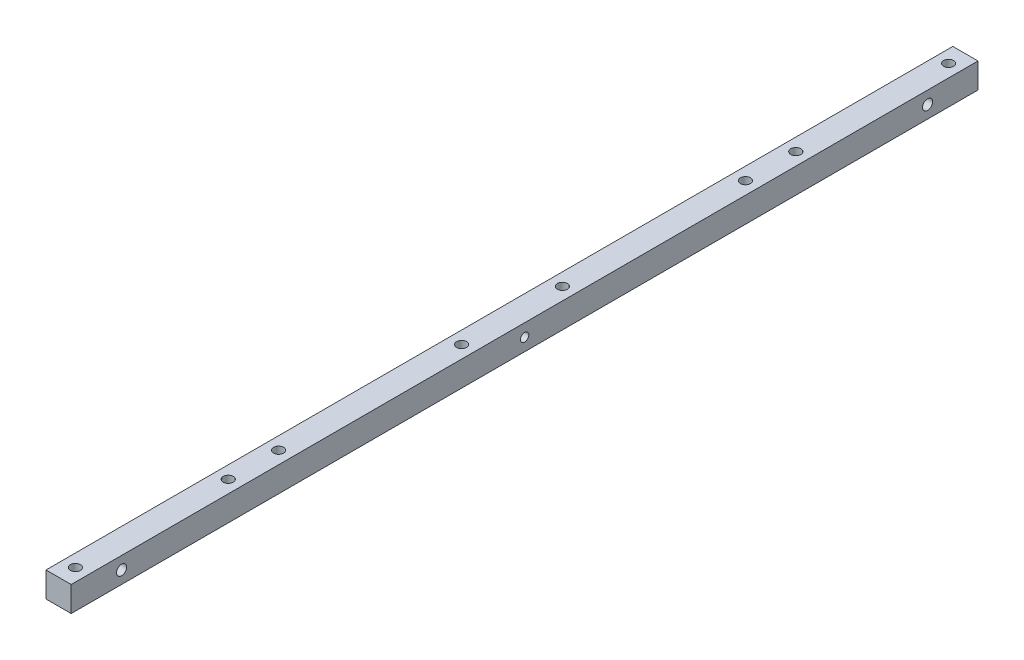
ISO-10303-21;
HEADER;
FILE_DESCRIPTION(('STEP AP214'),'2;1');
FILE_NAME('part.step','',(''),(''),'','','');
FILE_SCHEMA(('AUTOMOTIVE_DESIGN { 1 0 10303 214 1 1 1 1 }'));
ENDSEC;
DATA;
#1=APPLICATION_CONTEXT('core data for automotive mechanical design processes');
#2=APPLICATION_PROTOCOL_DEFINITION('international standard','automotive_design',2000,#1);
#3=PRODUCT_CONTEXT('',#1,'mechanical');
#4=PRODUCT('Part','Part','',(#3));
#5=PRODUCT_RELATED_PRODUCT_CATEGORY('part','',(#4));
#6=PRODUCT_DEFINITION_FORMATION('','',#4);
#7=PRODUCT_DEFINITION_CONTEXT('part definition',#1,'design');
#8=PRODUCT_DEFINITION('design','',#6,#7);
#9=PRODUCT_DEFINITION_SHAPE('','',#8);
#10=(LENGTH_UNIT() NAMED_UNIT(*) SI_UNIT(.MILLI.,.METRE.));
#11=(NAMED_UNIT(*) PLANE_ANGLE_UNIT() SI_UNIT($,.RADIAN.));
#12=(NAMED_UNIT(*) SI_UNIT($,.STERADIAN.) SOLID_ANGLE_UNIT());
#13=UNCERTAINTY_MEASURE_WITH_UNIT(LENGTH_MEASURE(1.E-05),#10,'distance_accuracy_value','');
#14=(GEOMETRIC_REPRESENTATION_CONTEXT(3) GLOBAL_UNCERTAINTY_ASSIGNED_CONTEXT((#13)) GLOBAL_UNIT_ASSIGNED_CONTEXT((#10,
#11,#12)) REPRESENTATION_CONTEXT('',''));
#15=CARTESIAN_POINT('',(0.,0.,0.));
#16=DIRECTION('',(0.,0.,1.));
#17=DIRECTION('',(1.,0.,0.));
#18=AXIS2_PLACEMENT_3D('',#15,#16,#17);
#19=CARTESIAN_POINT('',(3.75,-3.75,135.));
#20=DIRECTION('',(-1.,0.,0.));
#21=DIRECTION('',(0.,0.,1.));
#22=AXIS2_PLACEMENT_3D('',#19,#20,#21);
#23=PLANE('',#22);
#24=CARTESIAN_POINT('',(3.75,0.,120.));
#25=DIRECTION('',(1.,0.,0.));
#26=DIRECTION('',(0.,0.,-1.));
#27=AXIS2_PLACEMENT_3D('',#24,#25,#26);
#28=CIRCLE('',#27,1.5);
#29=CARTESIAN_POINT('',(3.75,0.,118.5));
#30=VERTEX_POINT('',#29);
#31=EDGE_CURVE('E122',#30,#30,#28,.T.);
#32=ORIENTED_EDGE('',*,*,#31,.F.);
#33=EDGE_LOOP('',(#32));
#34=FACE_BOUND('',#33,.T.);
#35=CARTESIAN_POINT('',(3.75,0.,-120.));
#36=DIRECTION('',(1.,0.,0.));
#37=DIRECTION('',(0.,0.,1.));
#38=AXIS2_PLACEMENT_3D('',#35,#36,#37);
#39=CIRCLE('',#38,1.5);
#40=CARTESIAN_POINT('',(3.75,0.,-121.5));
#41=VERTEX_POINT('',#40);
#42=EDGE_CURVE('E116',#41,#41,#39,.T.);
#43=ORIENTED_EDGE('',*,*,#42,.F.);
#44=EDGE_LOOP('',(#43));
#45=FACE_BOUND('',#44,.T.);
#46=CARTESIAN_POINT('',(3.75,0.,0.));
#47=DIRECTION('',(1.,0.,0.));
#48=DIRECTION('',(0.,0.,-1.));
#49=AXIS2_PLACEMENT_3D('',#46,#47,#48);
#50=CIRCLE('',#49,1.25);
#51=CARTESIAN_POINT('',(3.75,0.,-1.25));
#52=VERTEX_POINT('',#51);
#53=EDGE_CURVE('E109',#52,#52,#50,.T.);
#54=ORIENTED_EDGE('',*,*,#53,.F.);
#55=EDGE_LOOP('',(#54));
#56=FACE_BOUND('',#55,.T.);
#57=DIRECTION('',(0.,1.,0.));
#58=VECTOR('',#57,1.);
#59=CARTESIAN_POINT('',(3.75,-3.75,-135.));
#60=LINE('',#59,#58);
#61=CARTESIAN_POINT('',(3.75,-3.75,-135.));
#62=VERTEX_POINT('',#61);
#63=CARTESIAN_POINT('',(3.75,3.75,-135.));
#64=VERTEX_POINT('',#63);
#65=EDGE_CURVE('E95',#62,#64,#60,.T.);
#66=ORIENTED_EDGE('',*,*,#65,.T.);
#67=DIRECTION('',(0.,0.,-1.));
#68=VECTOR('',#67,1.);
#69=CARTESIAN_POINT('',(3.75,3.75,135.));
#70=LINE('',#69,#68);
#71=CARTESIAN_POINT('',(3.75,3.75,135.));
#72=VERTEX_POINT('',#71);
#73=EDGE_CURVE('E11',#72,#64,#70,.T.);
#74=ORIENTED_EDGE('',*,*,#73,.F.);
#75=DIRECTION('',(0.,1.,0.));
#76=VECTOR('',#75,1.);
#77=CARTESIAN_POINT('',(3.75,-3.75,135.));
#78=LINE('',#77,#76);
#79=CARTESIAN_POINT('',(3.75,-3.75,135.));
#80=VERTEX_POINT('',#79);
#81=EDGE_CURVE('E83',#80,#72,#78,.T.);
#82=ORIENTED_EDGE('',*,*,#81,.F.);
#83=DIRECTION('',(0.,0.,-1.));
#84=VECTOR('',#83,1.);
#85=CARTESIAN_POINT('',(3.75,-3.75,135.));
#86=LINE('',#85,#84);
#87=EDGE_CURVE('E91',#80,#62,#86,.T.);
#88=ORIENTED_EDGE('',*,*,#87,.T.);
#89=EDGE_LOOP('',(#66,#74,#82,#88));
#90=FACE_BOUND('',#89,.T.);
#91=ADVANCED_FACE('F32',(#34,#45,#56,#90),#23,.F.);
#92=CARTESIAN_POINT('',(-3.75,3.75,135.));
#93=DIRECTION('',(0.,-1.,0.));
#94=DIRECTION('',(0.,0.,-1.));
#95=AXIS2_PLACEMENT_3D('',#92,#93,#94);
#96=PLANE('',#95);
#97=CARTESIAN_POINT('',(0.,3.75,130.));
#98=DIRECTION('',(0.,1.,0.));
#99=DIRECTION('',(0.,0.,1.));
#100=AXIS2_PLACEMENT_3D('',#97,#98,#99);
#101=CIRCLE('',#100,1.5);
#102=CARTESIAN_POINT('',(0.,3.75,131.5));
#103=VERTEX_POINT('',#102);
#104=EDGE_CURVE('E145',#103,#103,#101,.T.);
#105=ORIENTED_EDGE('',*,*,#104,.F.);
#106=EDGE_LOOP('',(#105));
#107=FACE_BOUND('',#106,.T.);
#108=CARTESIAN_POINT('',(0.,3.75,-69.5));
#109=DIRECTION('',(0.,1.,0.));
#110=DIRECTION('',(0.,0.,-1.));
#111=AXIS2_PLACEMENT_3D('',#108,#109,#110);
#112=CIRCLE('',#111,1.5);
#113=CARTESIAN_POINT('',(0.,3.75,-71.));
#114=VERTEX_POINT('',#113);
#115=EDGE_CURVE('E152',#114,#114,#112,.T.);
#116=ORIENTED_EDGE('',*,*,#115,.F.);
#117=EDGE_LOOP('',(#116));
#118=FACE_BOUND('',#117,.T.);
#119=CARTESIAN_POINT('',(0.,3.75,-84.5));
#120=DIRECTION('',(0.,1.,0.));
#121=DIRECTION('',(0.,0.,-1.));
#122=AXIS2_PLACEMENT_3D('',#119,#120,#121);
#123=CIRCLE('',#122,1.5);
#124=CARTESIAN_POINT('',(0.,3.75,-86.));
#125=VERTEX_POINT('',#124);
#126=EDGE_CURVE('E133',#125,#125,#123,.T.);
#127=ORIENTED_EDGE('',*,*,#126,.F.);
#128=EDGE_LOOP('',(#127));
#129=FACE_BOUND('',#128,.T.);
#130=CARTESIAN_POINT('',(0.,3.75,84.5));
#131=DIRECTION('',(0.,1.,0.));
#132=DIRECTION('',(0.,0.,1.));
#133=AXIS2_PLACEMENT_3D('',#130,#131,#132);
#134=CIRCLE('',#133,1.5);
#135=CARTESIAN_POINT('',(0.,3.75,86.));
#136=VERTEX_POINT('',#135);
#137=EDGE_CURVE('E140',#136,#136,#134,.T.);
#138=ORIENTED_EDGE('',*,*,#137,.F.);
#139=EDGE_LOOP('',(#138));
#140=FACE_BOUND('',#139,.T.);
#141=CARTESIAN_POINT('',(0.,3.75,-15.));
#142=DIRECTION('',(0.,1.,0.));
#143=DIRECTION('',(0.,0.,-1.));
#144=AXIS2_PLACEMENT_3D('',#141,#142,#143);
#145=CIRCLE('',#144,1.5);
#146=CARTESIAN_POINT('',(0.,3.75,-16.5));
#147=VERTEX_POINT('',#146);
#148=EDGE_CURVE('E169',#147,#147,#145,.T.);
#149=ORIENTED_EDGE('',*,*,#148,.F.);
#150=EDGE_LOOP('',(#149));
#151=FACE_BOUND('',#150,.T.);
#152=CARTESIAN_POINT('',(0.,3.75,15.));
#153=DIRECTION('',(0.,1.,0.));
#154=DIRECTION('',(0.,0.,1.));
#155=AXIS2_PLACEMENT_3D('',#152,#153,#154);
#156=CIRCLE('',#155,1.5);
#157=CARTESIAN_POINT('',(0.,3.75,16.5));
#158=VERTEX_POINT('',#157);
#159=EDGE_CURVE('E157',#158,#158,#156,.T.);
#160=ORIENTED_EDGE('',*,*,#159,.F.);
#161=EDGE_LOOP('',(#160));
#162=FACE_BOUND('',#161,.T.);
#163=CARTESIAN_POINT('',(0.,3.75,-130.));
#164=DIRECTION('',(0.,1.,0.));
#165=DIRECTION('',(0.,0.,-1.));
#166=AXIS2_PLACEMENT_3D('',#163,#164,#165);
#167=CIRCLE('',#166,1.5);
#168=CARTESIAN_POINT('',(0.,3.75,-131.5));
#169=VERTEX_POINT('',#168);
#170=EDGE_CURVE('E164',#169,#169,#167,.T.);
#171=ORIENTED_EDGE('',*,*,#170,.F.);
#172=EDGE_LOOP('',(#171));
#173=FACE_BOUND('',#172,.T.);
#174=CARTESIAN_POINT('',(0.,3.75,69.5));
#175=DIRECTION('',(0.,1.,0.));
#176=DIRECTION('',(0.,0.,1.));
#177=AXIS2_PLACEMENT_3D('',#174,#175,#176);
#178=CIRCLE('',#177,1.5);
#179=CARTESIAN_POINT('',(0.,3.75,71.));
#180=VERTEX_POINT('',#179);
#181=EDGE_CURVE('E127',#180,#180,#178,.T.);
#182=ORIENTED_EDGE('',*,*,#181,.F.);
#183=EDGE_LOOP('',(#182));
#184=FACE_BOUND('',#183,.T.);
#185=DIRECTION('',(-1.,0.,0.));
#186=VECTOR('',#185,1.);
#187=CARTESIAN_POINT('',(-3.75,3.75,-135.));
#188=LINE('',#187,#186);
#189=CARTESIAN_POINT('',(-3.75,3.75,-135.));
#190=VERTEX_POINT('',#189);
#191=EDGE_CURVE('E87',#64,#190,#188,.T.);
#192=ORIENTED_EDGE('',*,*,#191,.T.);
#193=DIRECTION('',(0.,0.,-1.));
#194=VECTOR('',#193,1.);
#195=CARTESIAN_POINT('',(-3.75,3.75,135.));
#196=LINE('',#195,#194);
#197=CARTESIAN_POINT('',(-3.75,3.75,135.));
#198=VERTEX_POINT('',#197);
#199=EDGE_CURVE('E40',#198,#190,#196,.T.);
#200=ORIENTED_EDGE('',*,*,#199,.F.);
#201=DIRECTION('',(-1.,0.,0.));
#202=VECTOR('',#201,1.);
#203=CARTESIAN_POINT('',(-3.75,3.75,135.));
#204=LINE('',#203,#202);
#205=EDGE_CURVE('E78',#72,#198,#204,.T.);
#206=ORIENTED_EDGE('',*,*,#205,.F.);
#207=ORIENTED_EDGE('',*,*,#73,.T.);
#208=EDGE_LOOP('',(#192,#200,#206,#207));
#209=FACE_BOUND('',#208,.T.);
#210=ADVANCED_FACE('F86',(#107,#118,#129,#140,#151,#162,#173,#184,#209),#96,.F.);
#211=CARTESIAN_POINT('',(-3.75,-3.75,135.));
#212=DIRECTION('',(1.,0.,0.));
#213=DIRECTION('',(0.,0.,-1.));
#214=AXIS2_PLACEMENT_3D('',#211,#212,#213);
#215=PLANE('',#214);
#216=CARTESIAN_POINT('',(-3.75,0.,120.));
#217=DIRECTION('',(1.,0.,0.));
#218=DIRECTION('',(0.,0.,-1.));
#219=AXIS2_PLACEMENT_3D('',#216,#217,#218);
#220=CIRCLE('',#219,1.5);
#221=CARTESIAN_POINT('',(-3.75,0.,118.5));
#222=VERTEX_POINT('',#221);
#223=EDGE_CURVE('E98',#222,#222,#220,.T.);
#224=ORIENTED_EDGE('',*,*,#223,.T.);
#225=EDGE_LOOP('',(#224));
#226=FACE_BOUND('',#225,.T.);
#227=CARTESIAN_POINT('',(-3.75,0.,-120.));
#228=DIRECTION('',(1.,0.,0.));
#229=DIRECTION('',(0.,0.,1.));
#230=AXIS2_PLACEMENT_3D('',#227,#228,#229);
#231=CIRCLE('',#230,1.5);
#232=CARTESIAN_POINT('',(-3.75,0.,-121.5));
#233=VERTEX_POINT('',#232);
#234=EDGE_CURVE('E119',#233,#233,#231,.T.);
#235=ORIENTED_EDGE('',*,*,#234,.T.);
#236=EDGE_LOOP('',(#235));
#237=FACE_BOUND('',#236,.T.);
#238=CARTESIAN_POINT('',(-3.75,0.,0.));
#239=DIRECTION('',(1.,0.,0.));
#240=DIRECTION('',(0.,0.,-1.));
#241=AXIS2_PLACEMENT_3D('',#238,#239,#240);
#242=CIRCLE('',#241,1.25);
#243=CARTESIAN_POINT('',(-3.75,0.,-1.25));
#244=VERTEX_POINT('',#243);
#245=EDGE_CURVE('E112',#244,#244,#242,.T.);
#246=ORIENTED_EDGE('',*,*,#245,.T.);
#247=EDGE_LOOP('',(#246));
#248=FACE_BOUND('',#247,.T.);
#249=DIRECTION('',(0.,-1.,0.));
#250=VECTOR('',#249,1.);
#251=CARTESIAN_POINT('',(-3.75,-3.75,-135.));
#252=LINE('',#251,#250);
#253=CARTESIAN_POINT('',(-3.75,-3.75,-135.));
#254=VERTEX_POINT('',#253);
#255=EDGE_CURVE('E65',#190,#254,#252,.T.);
#256=ORIENTED_EDGE('',*,*,#255,.T.);
#257=DIRECTION('',(0.,0.,-1.));
#258=VECTOR('',#257,1.);
#259=CARTESIAN_POINT('',(-3.75,-3.75,135.));
#260=LINE('',#259,#258);
#261=CARTESIAN_POINT('',(-3.75,-3.75,135.));
#262=VERTEX_POINT('',#261);
#263=EDGE_CURVE('E88',#262,#254,#260,.T.);
#264=ORIENTED_EDGE('',*,*,#263,.F.);
#265=DIRECTION('',(0.,-1.,0.));
#266=VECTOR('',#265,1.);
#267=CARTESIAN_POINT('',(-3.75,-3.75,135.));
#268=LINE('',#267,#266);
#269=EDGE_CURVE('E81',#198,#262,#268,.T.);
#270=ORIENTED_EDGE('',*,*,#269,.F.);
#271=ORIENTED_EDGE('',*,*,#199,.T.);
#272=EDGE_LOOP('',(#256,#264,#270,#271));
#273=FACE_BOUND('',#272,.T.);
#274=ADVANCED_FACE('F89',(#226,#237,#248,#273),#215,.F.);
#275=CARTESIAN_POINT('',(-3.75,-3.75,135.));
#276=DIRECTION('',(0.,1.,0.));
#277=DIRECTION('',(0.,0.,1.));
#278=AXIS2_PLACEMENT_3D('',#275,#276,#277);
#279=PLANE('',#278);
#280=CARTESIAN_POINT('',(0.,-3.75,130.));
#281=DIRECTION('',(0.,1.,0.));
#282=DIRECTION('',(0.,0.,1.));
#283=AXIS2_PLACEMENT_3D('',#280,#281,#282);
#284=CIRCLE('',#283,1.5);
#285=CARTESIAN_POINT('',(0.,-3.75,131.5));
#286=VERTEX_POINT('',#285);
#287=EDGE_CURVE('E148',#286,#286,#284,.T.);
#288=ORIENTED_EDGE('',*,*,#287,.T.);
#289=EDGE_LOOP('',(#288));
#290=FACE_BOUND('',#289,.T.);
#291=CARTESIAN_POINT('',(0.,-3.75,-69.5));
#292=DIRECTION('',(0.,1.,0.));
#293=DIRECTION('',(0.,0.,-1.));
#294=AXIS2_PLACEMENT_3D('',#291,#292,#293);
#295=CIRCLE('',#294,1.5);
#296=CARTESIAN_POINT('',(0.,-3.75,-71.));
#297=VERTEX_POINT('',#296);
#298=EDGE_CURVE('E137',#297,#297,#295,.T.);
#299=ORIENTED_EDGE('',*,*,#298,.T.);
#300=EDGE_LOOP('',(#299));
#301=FACE_BOUND('',#300,.T.);
#302=CARTESIAN_POINT('',(0.,-3.75,-84.5));
#303=DIRECTION('',(0.,1.,0.));
#304=DIRECTION('',(0.,0.,-1.));
#305=AXIS2_PLACEMENT_3D('',#302,#303,#304);
#306=CIRCLE('',#305,1.5);
#307=CARTESIAN_POINT('',(0.,-3.75,-86.));
#308=VERTEX_POINT('',#307);
#309=EDGE_CURVE('E136',#308,#308,#306,.T.);
#310=ORIENTED_EDGE('',*,*,#309,.T.);
#311=EDGE_LOOP('',(#310));
#312=FACE_BOUND('',#311,.T.);
#313=CARTESIAN_POINT('',(0.,-3.75,84.5));
#314=DIRECTION('',(0.,1.,0.));
#315=DIRECTION('',(0.,0.,1.));
#316=AXIS2_PLACEMENT_3D('',#313,#314,#315);
#317=CIRCLE('',#316,1.5);
#318=CARTESIAN_POINT('',(0.,-3.75,86.));
#319=VERTEX_POINT('',#318);
#320=EDGE_CURVE('E130',#319,#319,#317,.T.);
#321=ORIENTED_EDGE('',*,*,#320,.T.);
#322=EDGE_LOOP('',(#321));
#323=FACE_BOUND('',#322,.T.);
#324=CARTESIAN_POINT('',(0.,-3.75,-15.));
#325=DIRECTION('',(0.,1.,0.));
#326=DIRECTION('',(0.,0.,-1.));
#327=AXIS2_PLACEMENT_3D('',#324,#325,#326);
#328=CIRCLE('',#327,1.5);
#329=CARTESIAN_POINT('',(0.,-3.75,-16.5));
#330=VERTEX_POINT('',#329);
#331=EDGE_CURVE('E161',#330,#330,#328,.T.);
#332=ORIENTED_EDGE('',*,*,#331,.T.);
#333=EDGE_LOOP('',(#332));
#334=FACE_BOUND('',#333,.T.);
#335=CARTESIAN_POINT('',(0.,-3.75,15.));
#336=DIRECTION('',(0.,1.,0.));
#337=DIRECTION('',(0.,0.,1.));
#338=AXIS2_PLACEMENT_3D('',#335,#336,#337);
#339=CIRCLE('',#338,1.5);
#340=CARTESIAN_POINT('',(0.,-3.75,16.5));
#341=VERTEX_POINT('',#340);
#342=EDGE_CURVE('E160',#341,#341,#339,.T.);
#343=ORIENTED_EDGE('',*,*,#342,.T.);
#344=EDGE_LOOP('',(#343));
#345=FACE_BOUND('',#344,.T.);
#346=CARTESIAN_POINT('',(0.,-3.75,-130.));
#347=DIRECTION('',(0.,1.,0.));
#348=DIRECTION('',(0.,0.,-1.));
#349=AXIS2_PLACEMENT_3D('',#346,#347,#348);
#350=CIRCLE('',#349,1.5);
#351=CARTESIAN_POINT('',(0.,-3.75,-131.5));
#352=VERTEX_POINT('',#351);
#353=EDGE_CURVE('E149',#352,#352,#350,.T.);
#354=ORIENTED_EDGE('',*,*,#353,.T.);
#355=EDGE_LOOP('',(#354));
#356=FACE_BOUND('',#355,.T.);
#357=CARTESIAN_POINT('',(0.,-3.75,69.5));
#358=DIRECTION('',(0.,1.,0.));
#359=DIRECTION('',(0.,0.,1.));
#360=AXIS2_PLACEMENT_3D('',#357,#358,#359);
#361=CIRCLE('',#360,1.5);
#362=CARTESIAN_POINT('',(0.,-3.75,71.));
#363=VERTEX_POINT('',#362);
#364=EDGE_CURVE('E113',#363,#363,#361,.T.);
#365=ORIENTED_EDGE('',*,*,#364,.T.);
#366=EDGE_LOOP('',(#365));
#367=FACE_BOUND('',#366,.T.);
#368=DIRECTION('',(1.,0.,0.));
#369=VECTOR('',#368,1.);
#370=CARTESIAN_POINT('',(-3.75,-3.75,-135.));
#371=LINE('',#370,#369);
#372=EDGE_CURVE('E71',#254,#62,#371,.T.);
#373=ORIENTED_EDGE('',*,*,#372,.T.);
#374=ORIENTED_EDGE('',*,*,#87,.F.);
#375=DIRECTION('',(1.,0.,0.));
#376=VECTOR('',#375,1.);
#377=CARTESIAN_POINT('',(-3.75,-3.75,135.));
#378=LINE('',#377,#376);
#379=EDGE_CURVE('E48',#262,#80,#378,.T.);
#380=ORIENTED_EDGE('',*,*,#379,.F.);
#381=ORIENTED_EDGE('',*,*,#263,.T.);
#382=EDGE_LOOP('',(#373,#374,#380,#381));
#383=FACE_BOUND('',#382,.T.);
#384=ADVANCED_FACE('F103',(#290,#301,#312,#323,#334,#345,#356,#367,#383),#279,.F.);
#385=CARTESIAN_POINT('',(0.,0.,135.));
#386=DIRECTION('',(0.,0.,-1.));
#387=DIRECTION('',(-1.,0.,0.));
#388=AXIS2_PLACEMENT_3D('',#385,#386,#387);
#389=PLANE('',#388);
#390=ORIENTED_EDGE('',*,*,#81,.T.);
#391=ORIENTED_EDGE('',*,*,#205,.T.);
#392=ORIENTED_EDGE('',*,*,#269,.T.);
#393=ORIENTED_EDGE('',*,*,#379,.T.);
#394=EDGE_LOOP('',(#390,#391,#392,#393));
#395=FACE_BOUND('',#394,.T.);
#396=ADVANCED_FACE('F79',(#395),#389,.F.);
#397=CARTESIAN_POINT('',(0.,0.,-135.));
#398=DIRECTION('',(0.,0.,-1.));
#399=DIRECTION('',(-1.,0.,0.));
#400=AXIS2_PLACEMENT_3D('',#397,#398,#399);
#401=PLANE('',#400);
#402=ORIENTED_EDGE('',*,*,#65,.F.);
#403=ORIENTED_EDGE('',*,*,#372,.F.);
#404=ORIENTED_EDGE('',*,*,#255,.F.);
#405=ORIENTED_EDGE('',*,*,#191,.F.);
#406=EDGE_LOOP('',(#402,#403,#404,#405));
#407=FACE_BOUND('',#406,.T.);
#408=ADVANCED_FACE('F106',(#407),#401,.T.);
#409=CARTESIAN_POINT('',(-3.75,0.,0.));
#410=DIRECTION('',(1.,0.,0.));
#411=DIRECTION('',(0.,0.,-1.));
#412=AXIS2_PLACEMENT_3D('',#409,#410,#411);
#413=CYLINDRICAL_SURFACE('',#412,1.25);
#414=CARTESIAN_POINT('',(-3.75,0.,-1.25));
#415=CARTESIAN_POINT('',(-3.671875,0.,-1.25));
#416=CARTESIAN_POINT('',(-3.59375,0.,-1.25));
#417=CARTESIAN_POINT('',(-3.4375,0.,-1.25));
#418=CARTESIAN_POINT('',(-3.359375,0.,-1.25));
#419=CARTESIAN_POINT('',(-3.203125,0.,-1.25));
#420=CARTESIAN_POINT('',(-3.125,0.,-1.25));
#421=CARTESIAN_POINT('',(-2.96875,0.,-1.25));
#422=CARTESIAN_POINT('',(-2.890625,0.,-1.25));
#423=CARTESIAN_POINT('',(-2.734375,0.,-1.25));
#424=CARTESIAN_POINT('',(-2.65625,0.,-1.25));
#425=CARTESIAN_POINT('',(-2.5,0.,-1.25));
#426=CARTESIAN_POINT('',(-2.421875,0.,-1.25));
#427=CARTESIAN_POINT('',(-2.265625,0.,-1.25));
#428=CARTESIAN_POINT('',(-2.1875,0.,-1.25));
#429=CARTESIAN_POINT('',(-2.03125,0.,-1.25));
#430=CARTESIAN_POINT('',(-1.953125,0.,-1.25));
#431=CARTESIAN_POINT('',(-1.796875,0.,-1.25));
#432=CARTESIAN_POINT('',(-1.71875,0.,-1.25));
#433=CARTESIAN_POINT('',(-1.5625,0.,-1.25));
#434=CARTESIAN_POINT('',(-1.484375,0.,-1.25));
#435=CARTESIAN_POINT('',(-1.328125,0.,-1.25));
#436=CARTESIAN_POINT('',(-1.25,0.,-1.25));
#437=CARTESIAN_POINT('',(-1.09375,0.,-1.25));
#438=CARTESIAN_POINT('',(-1.015625,0.,-1.25));
#439=CARTESIAN_POINT('',(-0.859375000000001,0.,-1.25));
#440=CARTESIAN_POINT('',(-0.781250000000001,0.,-1.25));
#441=CARTESIAN_POINT('',(-0.625000000000001,0.,-1.25));
#442=CARTESIAN_POINT('',(-0.546875000000001,0.,-1.25));
#443=CARTESIAN_POINT('',(-0.390625000000001,0.,-1.25));
#444=CARTESIAN_POINT('',(-0.312500000000001,0.,-1.25));
#445=CARTESIAN_POINT('',(-0.156250000000001,0.,-1.25));
#446=CARTESIAN_POINT('',(-0.0781250000000009,0.,-1.25));
#447=CARTESIAN_POINT('',(0.0781249999999992,0.,-1.25));
#448=CARTESIAN_POINT('',(0.156249999999999,0.,-1.25));
#449=CARTESIAN_POINT('',(0.312499999999999,0.,-1.25));
#450=CARTESIAN_POINT('',(0.390625,0.,-1.25));
#451=CARTESIAN_POINT('',(0.546874999999999,0.,-1.25));
#452=CARTESIAN_POINT('',(0.624999999999999,0.,-1.25));
#453=CARTESIAN_POINT('',(0.781249999999999,0.,-1.25));
#454=CARTESIAN_POINT('',(0.859374999999999,0.,-1.25));
#455=CARTESIAN_POINT('',(1.015625,0.,-1.25));
#456=CARTESIAN_POINT('',(1.09375,0.,-1.25));
#457=CARTESIAN_POINT('',(1.25,0.,-1.25));
#458=CARTESIAN_POINT('',(1.328125,0.,-1.25));
#459=CARTESIAN_POINT('',(1.484375,0.,-1.25));
#460=CARTESIAN_POINT('',(1.5625,0.,-1.25));
#461=CARTESIAN_POINT('',(1.71875,0.,-1.25));
#462=CARTESIAN_POINT('',(1.796875,0.,-1.25));
#463=CARTESIAN_POINT('',(1.953125,0.,-1.25));
#464=CARTESIAN_POINT('',(2.03125,0.,-1.25));
#465=CARTESIAN_POINT('',(2.1875,0.,-1.25));
#466=CARTESIAN_POINT('',(2.265625,0.,-1.25));
#467=CARTESIAN_POINT('',(2.421875,0.,-1.25));
#468=CARTESIAN_POINT('',(2.5,0.,-1.25));
#469=CARTESIAN_POINT('',(2.65625,0.,-1.25));
#470=CARTESIAN_POINT('',(2.734375,0.,-1.25));
#471=CARTESIAN_POINT('',(2.890625,0.,-1.25));
#472=CARTESIAN_POINT('',(2.96875,0.,-1.25));
#473=CARTESIAN_POINT('',(3.125,0.,-1.25));
#474=CARTESIAN_POINT('',(3.203125,0.,-1.25));
#475=CARTESIAN_POINT('',(3.359375,0.,-1.25));
#476=CARTESIAN_POINT('',(3.4375,0.,-1.25));
#477=CARTESIAN_POINT('',(3.59375,0.,-1.25));
#478=CARTESIAN_POINT('',(3.671875,0.,-1.25));
#479=CARTESIAN_POINT('',(3.75,0.,-1.25));
#480=B_SPLINE_CURVE_WITH_KNOTS('',3,(#414,#415,#416,#417,#418,#419,#420,#421,#422,#423,#424,
#425,#426,#427,#428,#429,#430,#431,#432,#433,#434,#435,#436,#437,#438,#439,#440,#441,#442,#443,
#444,#445,#446,#447,#448,#449,#450,#451,#452,#453,#454,#455,#456,#457,#458,#459,#460,#461,#462,
#463,#464,#465,#466,#467,#468,#469,#470,#471,#472,#473,#474,#475,#476,#477,#478,#479),
.UNSPECIFIED.,.F.,.F.,(4,2,2,2,2,2,2,2,2,2,2,2,2,2,2,2,2,2,2,2,2,2,2,2,2,2,2,2,2,2,2,2,4),(0.,
0.234375,0.46875,0.703125,0.9375,1.171875,1.40625,1.640625,1.875,2.109375,2.34375,2.578125,
2.8125,3.046875,3.28125,3.515625,3.75,3.984375,4.21875,4.453125,4.6875,4.921875,5.15625,
5.390625,5.625,5.859375,6.09375,6.328125,6.5625,6.796875,7.03125,7.265625,7.5),.UNSPECIFIED.);
#481=EDGE_CURVE('BSEAM221',#244,#52,#480,.T.);
#482=ORIENTED_EDGE('',*,*,#245,.F.);
#483=ORIENTED_EDGE('',*,*,#53,.T.);
#484=ORIENTED_EDGE('',*,*,#481,.T.);
#485=ORIENTED_EDGE('',*,*,#481,.F.);
#486=EDGE_LOOP('',(#482,#484,#483,#485));
#487=FACE_BOUND('',#486,.T.);
#488=ADVANCED_FACE('F221',(#487),#413,.F.);
#489=CARTESIAN_POINT('',(-3.75,0.,-120.));
#490=DIRECTION('',(1.,0.,0.));
#491=DIRECTION('',(0.,0.,-1.));
#492=AXIS2_PLACEMENT_3D('',#489,#490,#491);
#493=CYLINDRICAL_SURFACE('',#492,1.5);
#494=CARTESIAN_POINT('',(-3.75,0.,-121.5));
#495=CARTESIAN_POINT('',(-3.671875,0.,-121.5));
#496=CARTESIAN_POINT('',(-3.59375,0.,-121.5));
#497=CARTESIAN_POINT('',(-3.4375,0.,-121.5));
#498=CARTESIAN_POINT('',(-3.359375,0.,-121.5));
#499=CARTESIAN_POINT('',(-3.203125,0.,-121.5));
#500=CARTESIAN_POINT('',(-3.125,0.,-121.5));
#501=CARTESIAN_POINT('',(-2.96875,0.,-121.5));
#502=CARTESIAN_POINT('',(-2.890625,0.,-121.5));
#503=CARTESIAN_POINT('',(-2.734375,0.,-121.5));
#504=CARTESIAN_POINT('',(-2.65625,0.,-121.5));
#505=CARTESIAN_POINT('',(-2.5,0.,-121.5));
#506=CARTESIAN_POINT('',(-2.421875,0.,-121.5));
#507=CARTESIAN_POINT('',(-2.265625,0.,-121.5));
#508=CARTESIAN_POINT('',(-2.1875,0.,-121.5));
#509=CARTESIAN_POINT('',(-2.03125,0.,-121.5));
#510=CARTESIAN_POINT('',(-1.953125,0.,-121.5));
#511=CARTESIAN_POINT('',(-1.796875,0.,-121.5));
#512=CARTESIAN_POINT('',(-1.71875,0.,-121.5));
#513=CARTESIAN_POINT('',(-1.5625,0.,-121.5));
#514=CARTESIAN_POINT('',(-1.484375,0.,-121.5));
#515=CARTESIAN_POINT('',(-1.328125,0.,-121.5));
#516=CARTESIAN_POINT('',(-1.25,0.,-121.5));
#517=CARTESIAN_POINT('',(-1.09375,0.,-121.5));
#518=CARTESIAN_POINT('',(-1.015625,0.,-121.5));
#519=CARTESIAN_POINT('',(-0.859375000000001,0.,-121.5));
#520=CARTESIAN_POINT('',(-0.781250000000001,0.,-121.5));
#521=CARTESIAN_POINT('',(-0.625000000000001,0.,-121.5));
#522=CARTESIAN_POINT('',(-0.546875000000001,0.,-121.5));
#523=CARTESIAN_POINT('',(-0.390625000000001,0.,-121.5));
#524=CARTESIAN_POINT('',(-0.312500000000001,0.,-121.5));
#525=CARTESIAN_POINT('',(-0.156250000000001,0.,-121.5));
#526=CARTESIAN_POINT('',(-0.0781250000000009,0.,-121.5));
#527=CARTESIAN_POINT('',(0.0781249999999992,0.,-121.5));
#528=CARTESIAN_POINT('',(0.156249999999999,0.,-121.5));
#529=CARTESIAN_POINT('',(0.312499999999999,0.,-121.5));
#530=CARTESIAN_POINT('',(0.390625,0.,-121.5));
#531=CARTESIAN_POINT('',(0.546874999999999,0.,-121.5));
#532=CARTESIAN_POINT('',(0.624999999999999,0.,-121.5));
#533=CARTESIAN_POINT('',(0.781249999999999,0.,-121.5));
#534=CARTESIAN_POINT('',(0.859374999999999,0.,-121.5));
#535=CARTESIAN_POINT('',(1.015625,0.,-121.5));
#536=CARTESIAN_POINT('',(1.09375,0.,-121.5));
#537=CARTESIAN_POINT('',(1.25,0.,-121.5));
#538=CARTESIAN_POINT('',(1.328125,0.,-121.5));
#539=CARTESIAN_POINT('',(1.484375,0.,-121.5));
#540=CARTESIAN_POINT('',(1.5625,0.,-121.5));
#541=CARTESIAN_POINT('',(1.71875,0.,-121.5));
#542=CARTESIAN_POINT('',(1.796875,0.,-121.5));
#543=CARTESIAN_POINT('',(1.953125,0.,-121.5));
#544=CARTESIAN_POINT('',(2.03125,0.,-121.5));
#545=CARTESIAN_POINT('',(2.1875,0.,-121.5));
#546=CARTESIAN_POINT('',(2.265625,0.,-121.5));
#547=CARTESIAN_POINT('',(2.421875,0.,-121.5));
#548=CARTESIAN_POINT('',(2.5,0.,-121.5));
#549=CARTESIAN_POINT('',(2.65625,0.,-121.5));
#550=CARTESIAN_POINT('',(2.734375,0.,-121.5));
#551=CARTESIAN_POINT('',(2.890625,0.,-121.5));
#552=CARTESIAN_POINT('',(2.96875,0.,-121.5));
#553=CARTESIAN_POINT('',(3.125,0.,-121.5));
#554=CARTESIAN_POINT('',(3.203125,0.,-121.5));
#555=CARTESIAN_POINT('',(3.359375,0.,-121.5));
#556=CARTESIAN_POINT('',(3.4375,0.,-121.5));
#557=CARTESIAN_POINT('',(3.59375,0.,-121.5));
#558=CARTESIAN_POINT('',(3.671875,0.,-121.5));
#559=CARTESIAN_POINT('',(3.75,0.,-121.5));
#560=B_SPLINE_CURVE_WITH_KNOTS('',3,(#494,#495,#496,#497,#498,#499,#500,#501,#502,#503,#504,
#505,#506,#507,#508,#509,#510,#511,#512,#513,#514,#515,#516,#517,#518,#519,#520,#521,#522,#523,
#524,#525,#526,#527,#528,#529,#530,#531,#532,#533,#534,#535,#536,#537,#538,#539,#540,#541,#542,
#543,#544,#545,#546,#547,#548,#549,#550,#551,#552,#553,#554,#555,#556,#557,#558,#559),
.UNSPECIFIED.,.F.,.F.,(4,2,2,2,2,2,2,2,2,2,2,2,2,2,2,2,2,2,2,2,2,2,2,2,2,2,2,2,2,2,2,2,4),(0.,
0.234375,0.46875,0.703125,0.9375,1.171875,1.40625,1.640625,1.875,2.109375,2.34375,2.578125,
2.8125,3.046875,3.28125,3.515625,3.75,3.984375,4.21875,4.453125,4.6875,4.921875,5.15625,
5.390625,5.625,5.859375,6.09375,6.328125,6.5625,6.796875,7.03125,7.265625,7.5),.UNSPECIFIED.);
#561=EDGE_CURVE('BSEAM206',#233,#41,#560,.T.);
#562=ORIENTED_EDGE('',*,*,#234,.F.);
#563=ORIENTED_EDGE('',*,*,#42,.T.);
#564=ORIENTED_EDGE('',*,*,#561,.T.);
#565=ORIENTED_EDGE('',*,*,#561,.F.);
#566=EDGE_LOOP('',(#562,#564,#563,#565));
#567=FACE_BOUND('',#566,.T.);
#568=ADVANCED_FACE('F206',(#567),#493,.F.);
#569=CARTESIAN_POINT('',(-3.75,0.,120.));
#570=DIRECTION('',(1.,0.,0.));
#571=DIRECTION('',(0.,0.,-1.));
#572=AXIS2_PLACEMENT_3D('',#569,#570,#571);
#573=CYLINDRICAL_SURFACE('',#572,1.5);
#574=CARTESIAN_POINT('',(-3.75,0.,118.5));
#575=CARTESIAN_POINT('',(-3.671875,0.,118.5));
#576=CARTESIAN_POINT('',(-3.59375,0.,118.5));
#577=CARTESIAN_POINT('',(-3.4375,0.,118.5));
#578=CARTESIAN_POINT('',(-3.359375,0.,118.5));
#579=CARTESIAN_POINT('',(-3.203125,0.,118.5));
#580=CARTESIAN_POINT('',(-3.125,0.,118.5));
#581=CARTESIAN_POINT('',(-2.96875,0.,118.5));
#582=CARTESIAN_POINT('',(-2.890625,0.,118.5));
#583=CARTESIAN_POINT('',(-2.734375,0.,118.5));
#584=CARTESIAN_POINT('',(-2.65625,0.,118.5));
#585=CARTESIAN_POINT('',(-2.5,0.,118.5));
#586=CARTESIAN_POINT('',(-2.421875,0.,118.5));
#587=CARTESIAN_POINT('',(-2.265625,0.,118.5));
#588=CARTESIAN_POINT('',(-2.1875,0.,118.5));
#589=CARTESIAN_POINT('',(-2.03125,0.,118.5));
#590=CARTESIAN_POINT('',(-1.953125,0.,118.5));
#591=CARTESIAN_POINT('',(-1.796875,0.,118.5));
#592=CARTESIAN_POINT('',(-1.71875,0.,118.5));
#593=CARTESIAN_POINT('',(-1.5625,0.,118.5));
#594=CARTESIAN_POINT('',(-1.484375,0.,118.5));
#595=CARTESIAN_POINT('',(-1.328125,0.,118.5));
#596=CARTESIAN_POINT('',(-1.25,0.,118.5));
#597=CARTESIAN_POINT('',(-1.09375,0.,118.5));
#598=CARTESIAN_POINT('',(-1.015625,0.,118.5));
#599=CARTESIAN_POINT('',(-0.859375000000001,0.,118.5));
#600=CARTESIAN_POINT('',(-0.781250000000001,0.,118.5));
#601=CARTESIAN_POINT('',(-0.625000000000001,0.,118.5));
#602=CARTESIAN_POINT('',(-0.546875000000001,0.,118.5));
#603=CARTESIAN_POINT('',(-0.390625000000001,0.,118.5));
#604=CARTESIAN_POINT('',(-0.312500000000001,0.,118.5));
#605=CARTESIAN_POINT('',(-0.156250000000001,0.,118.5));
#606=CARTESIAN_POINT('',(-0.0781250000000009,0.,118.5));
#607=CARTESIAN_POINT('',(0.0781249999999992,0.,118.5));
#608=CARTESIAN_POINT('',(0.156249999999999,0.,118.5));
#609=CARTESIAN_POINT('',(0.312499999999999,0.,118.5));
#610=CARTESIAN_POINT('',(0.390625,0.,118.5));
#611=CARTESIAN_POINT('',(0.546874999999999,0.,118.5));
#612=CARTESIAN_POINT('',(0.624999999999999,0.,118.5));
#613=CARTESIAN_POINT('',(0.781249999999999,0.,118.5));
#614=CARTESIAN_POINT('',(0.859374999999999,0.,118.5));
#615=CARTESIAN_POINT('',(1.015625,0.,118.5));
#616=CARTESIAN_POINT('',(1.09375,0.,118.5));
#617=CARTESIAN_POINT('',(1.25,0.,118.5));
#618=CARTESIAN_POINT('',(1.328125,0.,118.5));
#619=CARTESIAN_POINT('',(1.484375,0.,118.5));
#620=CARTESIAN_POINT('',(1.5625,0.,118.5));
#621=CARTESIAN_POINT('',(1.71875,0.,118.5));
#622=CARTESIAN_POINT('',(1.796875,0.,118.5));
#623=CARTESIAN_POINT('',(1.953125,0.,118.5));
#624=CARTESIAN_POINT('',(2.03125,0.,118.5));
#625=CARTESIAN_POINT('',(2.1875,0.,118.5));
#626=CARTESIAN_POINT('',(2.265625,0.,118.5));
#627=CARTESIAN_POINT('',(2.421875,0.,118.5));
#628=CARTESIAN_POINT('',(2.5,0.,118.5));
#629=CARTESIAN_POINT('',(2.65625,0.,118.5));
#630=CARTESIAN_POINT('',(2.734375,0.,118.5));
#631=CARTESIAN_POINT('',(2.890625,0.,118.5));
#632=CARTESIAN_POINT('',(2.96875,0.,118.5));
#633=CARTESIAN_POINT('',(3.125,0.,118.5));
#634=CARTESIAN_POINT('',(3.203125,0.,118.5));
#635=CARTESIAN_POINT('',(3.359375,0.,118.5));
#636=CARTESIAN_POINT('',(3.4375,0.,118.5));
#637=CARTESIAN_POINT('',(3.59375,0.,118.5));
#638=CARTESIAN_POINT('',(3.671875,0.,118.5));
#639=CARTESIAN_POINT('',(3.75,0.,118.5));
#640=B_SPLINE_CURVE_WITH_KNOTS('',3,(#574,#575,#576,#577,#578,#579,#580,#581,#582,#583,#584,
#585,#586,#587,#588,#589,#590,#591,#592,#593,#594,#595,#596,#597,#598,#599,#600,#601,#602,#603,
#604,#605,#606,#607,#608,#609,#610,#611,#612,#613,#614,#615,#616,#617,#618,#619,#620,#621,#622,
#623,#624,#625,#626,#627,#628,#629,#630,#631,#632,#633,#634,#635,#636,#637,#638,#639),
.UNSPECIFIED.,.F.,.F.,(4,2,2,2,2,2,2,2,2,2,2,2,2,2,2,2,2,2,2,2,2,2,2,2,2,2,2,2,2,2,2,2,4),(0.,
0.234375,0.46875,0.703125,0.9375,1.171875,1.40625,1.640625,1.875,2.109375,2.34375,2.578125,
2.8125,3.046875,3.28125,3.515625,3.75,3.984375,4.21875,4.453125,4.6875,4.921875,5.15625,
5.390625,5.625,5.859375,6.09375,6.328125,6.5625,6.796875,7.03125,7.265625,7.5),.UNSPECIFIED.);
#641=EDGE_CURVE('BSEAM197',#222,#30,#640,.T.);
#642=ORIENTED_EDGE('',*,*,#223,.F.);
#643=ORIENTED_EDGE('',*,*,#31,.T.);
#644=ORIENTED_EDGE('',*,*,#641,.T.);
#645=ORIENTED_EDGE('',*,*,#641,.F.);
#646=EDGE_LOOP('',(#642,#644,#643,#645));
#647=FACE_BOUND('',#646,.T.);
#648=ADVANCED_FACE('F197',(#647),#573,.F.);
#649=CARTESIAN_POINT('',(0.,-3.75,69.5));
#650=DIRECTION('',(0.,1.,0.));
#651=DIRECTION('',(0.,0.,1.));
#652=AXIS2_PLACEMENT_3D('',#649,#650,#651);
#653=CYLINDRICAL_SURFACE('',#652,1.5);
#654=ORIENTED_EDGE('',*,*,#364,.F.);
#655=EDGE_LOOP('',(#654));
#656=FACE_BOUND('',#655,.T.);
#657=ORIENTED_EDGE('',*,*,#181,.T.);
#658=EDGE_LOOP('',(#657));
#659=FACE_BOUND('',#658,.T.);
#660=ADVANCED_FACE('F194',(#656,#659),#653,.F.);
#661=CARTESIAN_POINT('',(0.,-3.75,-130.));
#662=DIRECTION('',(0.,1.,0.));
#663=DIRECTION('',(0.,0.,1.));
#664=AXIS2_PLACEMENT_3D('',#661,#662,#663);
#665=CYLINDRICAL_SURFACE('',#664,1.5);
#666=ORIENTED_EDGE('',*,*,#353,.F.);
#667=EDGE_LOOP('',(#666));
#668=FACE_BOUND('',#667,.T.);
#669=ORIENTED_EDGE('',*,*,#170,.T.);
#670=EDGE_LOOP('',(#669));
#671=FACE_BOUND('',#670,.T.);
#672=ADVANCED_FACE('F196',(#668,#671),#665,.F.);
#673=CARTESIAN_POINT('',(0.,-3.75,15.));
#674=DIRECTION('',(0.,1.,0.));
#675=DIRECTION('',(0.,0.,1.));
#676=AXIS2_PLACEMENT_3D('',#673,#674,#675);
#677=CYLINDRICAL_SURFACE('',#676,1.5);
#678=ORIENTED_EDGE('',*,*,#342,.F.);
#679=EDGE_LOOP('',(#678));
#680=FACE_BOUND('',#679,.T.);
#681=ORIENTED_EDGE('',*,*,#159,.T.);
#682=EDGE_LOOP('',(#681));
#683=FACE_BOUND('',#682,.T.);
#684=ADVANCED_FACE('F181',(#680,#683),#677,.F.);
#685=CARTESIAN_POINT('',(0.,-3.75,-15.));
#686=DIRECTION('',(0.,1.,0.));
#687=DIRECTION('',(0.,0.,1.));
#688=AXIS2_PLACEMENT_3D('',#685,#686,#687);
#689=CYLINDRICAL_SURFACE('',#688,1.5);
#690=ORIENTED_EDGE('',*,*,#331,.F.);
#691=EDGE_LOOP('',(#690));
#692=FACE_BOUND('',#691,.T.);
#693=ORIENTED_EDGE('',*,*,#148,.T.);
#694=EDGE_LOOP('',(#693));
#695=FACE_BOUND('',#694,.T.);
#696=ADVANCED_FACE('F177',(#692,#695),#689,.F.);
#697=CARTESIAN_POINT('',(0.,-3.75,84.5));
#698=DIRECTION('',(0.,1.,0.));
#699=DIRECTION('',(0.,0.,1.));
#700=AXIS2_PLACEMENT_3D('',#697,#698,#699);
#701=CYLINDRICAL_SURFACE('',#700,1.5);
#702=ORIENTED_EDGE('',*,*,#320,.F.);
#703=EDGE_LOOP('',(#702));
#704=FACE_BOUND('',#703,.T.);
#705=ORIENTED_EDGE('',*,*,#137,.T.);
#706=EDGE_LOOP('',(#705));
#707=FACE_BOUND('',#706,.T.);
#708=ADVANCED_FACE('F180',(#704,#707),#701,.F.);
#709=CARTESIAN_POINT('',(0.,-3.75,-84.5));
#710=DIRECTION('',(0.,1.,0.));
#711=DIRECTION('',(0.,0.,1.));
#712=AXIS2_PLACEMENT_3D('',#709,#710,#711);
#713=CYLINDRICAL_SURFACE('',#712,1.5);
#714=ORIENTED_EDGE('',*,*,#309,.F.);
#715=EDGE_LOOP('',(#714));
#716=FACE_BOUND('',#715,.T.);
#717=ORIENTED_EDGE('',*,*,#126,.T.);
#718=EDGE_LOOP('',(#717));
#719=FACE_BOUND('',#718,.T.);
#720=ADVANCED_FACE('F325',(#716,#719),#713,.F.);
#721=CARTESIAN_POINT('',(0.,-3.75,-69.5));
#722=DIRECTION('',(0.,1.,0.));
#723=DIRECTION('',(0.,0.,1.));
#724=AXIS2_PLACEMENT_3D('',#721,#722,#723);
#725=CYLINDRICAL_SURFACE('',#724,1.5);
#726=ORIENTED_EDGE('',*,*,#298,.F.);
#727=EDGE_LOOP('',(#726));
#728=FACE_BOUND('',#727,.T.);
#729=ORIENTED_EDGE('',*,*,#115,.T.);
#730=EDGE_LOOP('',(#729));
#731=FACE_BOUND('',#730,.T.);
#732=ADVANCED_FACE('F334',(#728,#731),#725,.F.);
#733=CARTESIAN_POINT('',(0.,-3.75,130.));
#734=DIRECTION('',(0.,1.,0.));
#735=DIRECTION('',(0.,0.,1.));
#736=AXIS2_PLACEMENT_3D('',#733,#734,#735);
#737=CYLINDRICAL_SURFACE('',#736,1.5);
#738=ORIENTED_EDGE('',*,*,#287,.F.);
#739=EDGE_LOOP('',(#738));
#740=FACE_BOUND('',#739,.T.);
#741=ORIENTED_EDGE('',*,*,#104,.T.);
#742=EDGE_LOOP('',(#741));
#743=FACE_BOUND('',#742,.T.);
#744=ADVANCED_FACE('F342',(#740,#743),#737,.F.);
#745=CLOSED_SHELL('',(#91,#210,#274,#384,#396,#408,#488,#568,#648,#660,#672,#684,#696,#708,#720,
#732,#744));
#746=MANIFOLD_SOLID_BREP('B2',#745);
#747=ADVANCED_BREP_SHAPE_REPRESENTATION('',(#18,#746),#14);
#748=SHAPE_DEFINITION_REPRESENTATION(#9,#747);
ENDSEC;
END-ISO-10303-21;
